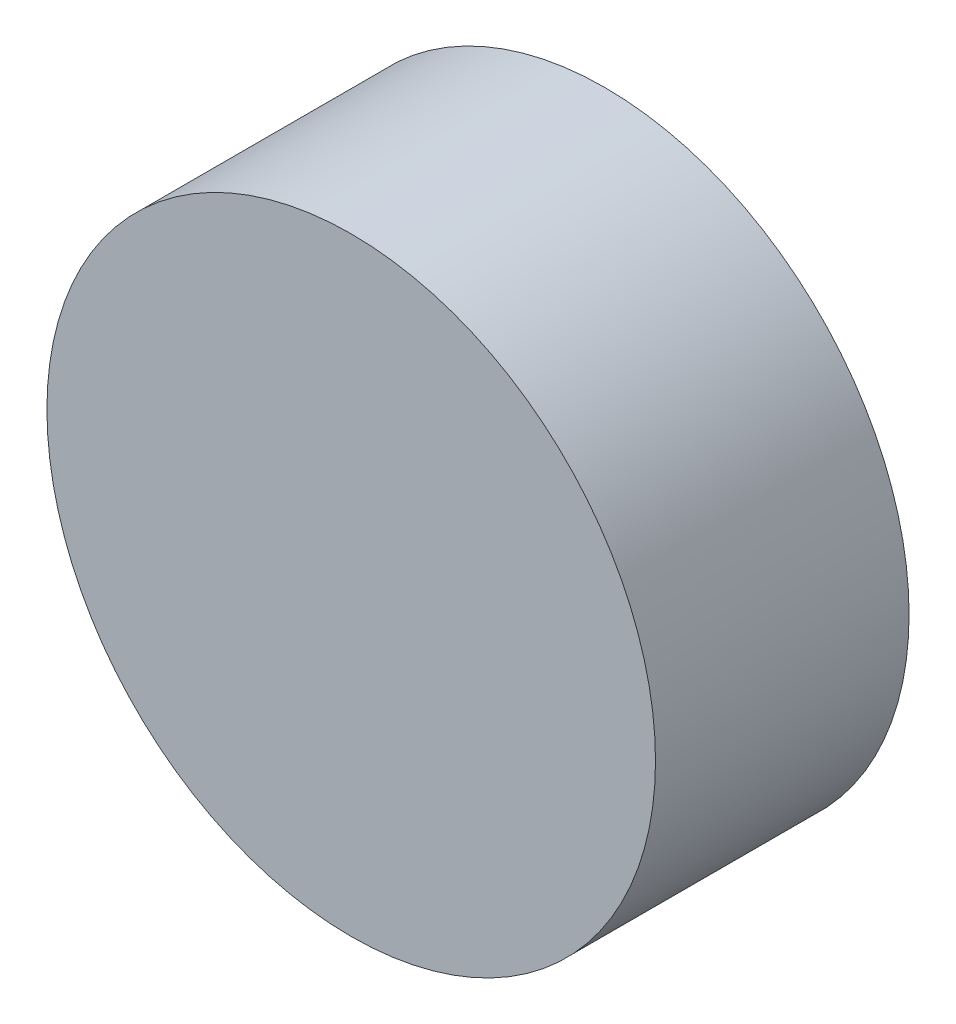
ISO-10303-21;
HEADER;
FILE_DESCRIPTION(('STEP AP214'),'2;1');
FILE_NAME('part.step','',(''),(''),'','','');
FILE_SCHEMA(('AUTOMOTIVE_DESIGN { 1 0 10303 214 1 1 1 1 }'));
ENDSEC;
DATA;
#1=APPLICATION_CONTEXT('core data for automotive mechanical design processes');
#2=APPLICATION_PROTOCOL_DEFINITION('international standard','automotive_design',2000,#1);
#3=PRODUCT_CONTEXT('',#1,'mechanical');
#4=PRODUCT('Part','Part','',(#3));
#5=PRODUCT_RELATED_PRODUCT_CATEGORY('part','',(#4));
#6=PRODUCT_DEFINITION_FORMATION('','',#4);
#7=PRODUCT_DEFINITION_CONTEXT('part definition',#1,'design');
#8=PRODUCT_DEFINITION('design','',#6,#7);
#9=PRODUCT_DEFINITION_SHAPE('','',#8);
#10=(LENGTH_UNIT() NAMED_UNIT(*) SI_UNIT(.MILLI.,.METRE.));
#11=(NAMED_UNIT(*) PLANE_ANGLE_UNIT() SI_UNIT($,.RADIAN.));
#12=(NAMED_UNIT(*) SI_UNIT($,.STERADIAN.) SOLID_ANGLE_UNIT());
#13=UNCERTAINTY_MEASURE_WITH_UNIT(LENGTH_MEASURE(1.E-05),#10,'distance_accuracy_value','');
#14=(GEOMETRIC_REPRESENTATION_CONTEXT(3) GLOBAL_UNCERTAINTY_ASSIGNED_CONTEXT((#13)) GLOBAL_UNIT_ASSIGNED_CONTEXT((#10,
#11,#12)) REPRESENTATION_CONTEXT('',''));
#15=CARTESIAN_POINT('',(0.,0.,0.));
#16=DIRECTION('',(0.,0.,1.));
#17=DIRECTION('',(1.,0.,0.));
#18=AXIS2_PLACEMENT_3D('',#15,#16,#17);
#19=CARTESIAN_POINT('',(-267.499543018167,75.8854306088731,-3.));
#20=DIRECTION('',(0.,0.,1.));
#21=DIRECTION('',(1.,0.,0.));
#22=AXIS2_PLACEMENT_3D('',#19,#20,#21);
#23=CYLINDRICAL_SURFACE('',#22,3.60000000000001);
#24=CARTESIAN_POINT('',(-267.499543018167,75.8854306088731,-3.));
#25=DIRECTION('',(0.,0.,1.));
#26=DIRECTION('',(1.,0.,0.));
#27=AXIS2_PLACEMENT_3D('',#24,#25,#26);
#28=CIRCLE('',#27,3.60000000000001);
#29=CARTESIAN_POINT('',(-263.899543018167,75.8854306088731,-3.));
#30=VERTEX_POINT('',#29);
#31=EDGE_CURVE('E10',#30,#30,#28,.T.);
#32=ORIENTED_EDGE('',*,*,#31,.T.);
#33=EDGE_LOOP('',(#32));
#34=FACE_BOUND('',#33,.T.);
#35=CARTESIAN_POINT('',(-267.499543018167,75.8854306088731,0.));
#36=DIRECTION('',(0.,0.,1.));
#37=DIRECTION('',(1.,0.,0.));
#38=AXIS2_PLACEMENT_3D('',#35,#36,#37);
#39=CIRCLE('',#38,3.60000000000001);
#40=CARTESIAN_POINT('',(-263.899543018167,75.8854306088731,0.));
#41=VERTEX_POINT('',#40);
#42=EDGE_CURVE('E34',#41,#41,#39,.T.);
#43=ORIENTED_EDGE('',*,*,#42,.F.);
#44=EDGE_LOOP('',(#43));
#45=FACE_BOUND('',#44,.T.);
#46=ADVANCED_FACE('F31',(#34,#45),#23,.T.);
#47=CARTESIAN_POINT('',(-267.499543018167,75.8854306088731,-3.));
#48=DIRECTION('',(0.,0.,1.));
#49=DIRECTION('',(1.,0.,0.));
#50=AXIS2_PLACEMENT_3D('',#47,#48,#49);
#51=PLANE('',#50);
#52=ORIENTED_EDGE('',*,*,#31,.F.);
#53=EDGE_LOOP('',(#52));
#54=FACE_BOUND('',#53,.T.);
#55=ADVANCED_FACE('F46',(#54),#51,.F.);
#56=CARTESIAN_POINT('',(-267.499543018167,75.8854306088731,0.));
#57=DIRECTION('',(0.,0.,1.));
#58=DIRECTION('',(1.,0.,0.));
#59=AXIS2_PLACEMENT_3D('',#56,#57,#58);
#60=PLANE('',#59);
#61=ORIENTED_EDGE('',*,*,#42,.T.);
#62=EDGE_LOOP('',(#61));
#63=FACE_BOUND('',#62,.T.);
#64=ADVANCED_FACE('F43',(#63),#60,.T.);
#65=CLOSED_SHELL('',(#46,#55,#64));
#66=MANIFOLD_SOLID_BREP('B2',#65);
#67=ADVANCED_BREP_SHAPE_REPRESENTATION('',(#18,#66),#14);
#68=SHAPE_DEFINITION_REPRESENTATION(#9,#67);
ENDSEC;
END-ISO-10303-21;
